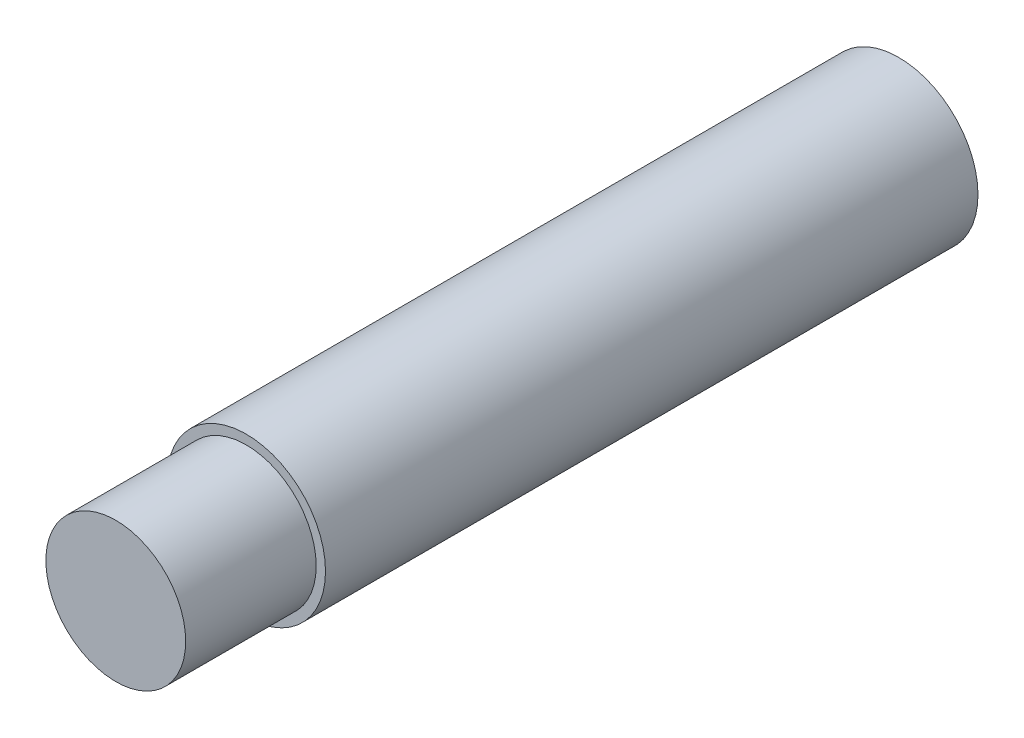
ISO-10303-21;
HEADER;
FILE_DESCRIPTION(('STEP AP214'),'2;1');
FILE_NAME('part.step','',(''),(''),'','','');
FILE_SCHEMA(('AUTOMOTIVE_DESIGN { 1 0 10303 214 1 1 1 1 }'));
ENDSEC;
DATA;
#1=APPLICATION_CONTEXT('core data for automotive mechanical design processes');
#2=APPLICATION_PROTOCOL_DEFINITION('international standard','automotive_design',2000,#1);
#3=PRODUCT_CONTEXT('',#1,'mechanical');
#4=PRODUCT('Part','Part','',(#3));
#5=PRODUCT_RELATED_PRODUCT_CATEGORY('part','',(#4));
#6=PRODUCT_DEFINITION_FORMATION('','',#4);
#7=PRODUCT_DEFINITION_CONTEXT('part definition',#1,'design');
#8=PRODUCT_DEFINITION('design','',#6,#7);
#9=PRODUCT_DEFINITION_SHAPE('','',#8);
#10=(LENGTH_UNIT() NAMED_UNIT(*) SI_UNIT(.MILLI.,.METRE.));
#11=(NAMED_UNIT(*) PLANE_ANGLE_UNIT() SI_UNIT($,.RADIAN.));
#12=(NAMED_UNIT(*) SI_UNIT($,.STERADIAN.) SOLID_ANGLE_UNIT());
#13=UNCERTAINTY_MEASURE_WITH_UNIT(LENGTH_MEASURE(1.E-05),#10,'distance_accuracy_value','');
#14=(GEOMETRIC_REPRESENTATION_CONTEXT(3) GLOBAL_UNCERTAINTY_ASSIGNED_CONTEXT((#13)) GLOBAL_UNIT_ASSIGNED_CONTEXT((#10,
#11,#12)) REPRESENTATION_CONTEXT('',''));
#15=CARTESIAN_POINT('',(0.,0.,0.));
#16=DIRECTION('',(0.,0.,1.));
#17=DIRECTION('',(1.,0.,0.));
#18=AXIS2_PLACEMENT_3D('',#15,#16,#17);
#19=CARTESIAN_POINT('',(0.,0.,35.));
#20=DIRECTION('',(0.,0.,-1.));
#21=DIRECTION('',(-1.,0.,0.));
#22=AXIS2_PLACEMENT_3D('',#19,#20,#21);
#23=CYLINDRICAL_SURFACE('',#22,4.25);
#24=CARTESIAN_POINT('',(0.,0.,35.));
#25=DIRECTION('',(0.,0.,1.));
#26=DIRECTION('',(1.,0.,0.));
#27=AXIS2_PLACEMENT_3D('',#24,#25,#26);
#28=CIRCLE('',#27,4.25);
#29=CARTESIAN_POINT('',(4.25,0.,35.));
#30=VERTEX_POINT('',#29);
#31=EDGE_CURVE('E48',#30,#30,#28,.T.);
#32=ORIENTED_EDGE('',*,*,#31,.F.);
#33=EDGE_LOOP('',(#32));
#34=FACE_BOUND('',#33,.T.);
#35=CARTESIAN_POINT('',(0.,0.,0.));
#36=DIRECTION('',(0.,0.,1.));
#37=DIRECTION('',(1.,0.,0.));
#38=AXIS2_PLACEMENT_3D('',#35,#36,#37);
#39=CIRCLE('',#38,4.25);
#40=CARTESIAN_POINT('',(4.25,0.,0.));
#41=VERTEX_POINT('',#40);
#42=EDGE_CURVE('E53',#41,#41,#39,.T.);
#43=ORIENTED_EDGE('',*,*,#42,.T.);
#44=EDGE_LOOP('',(#43));
#45=FACE_BOUND('',#44,.T.);
#46=ADVANCED_FACE('F41',(#34,#45),#23,.T.);
#47=CARTESIAN_POINT('',(0.,0.,35.));
#48=DIRECTION('',(0.,0.,1.));
#49=DIRECTION('',(1.,0.,0.));
#50=AXIS2_PLACEMENT_3D('',#47,#48,#49);
#51=PLANE('',#50);
#52=CARTESIAN_POINT('',(0.,0.,35.));
#53=DIRECTION('',(0.,0.,1.));
#54=DIRECTION('',(1.,0.,0.));
#55=AXIS2_PLACEMENT_3D('',#52,#53,#54);
#56=CIRCLE('',#55,3.75);
#57=CARTESIAN_POINT('',(3.75,0.,35.));
#58=VERTEX_POINT('',#57);
#59=EDGE_CURVE('E10',#58,#58,#56,.T.);
#60=ORIENTED_EDGE('',*,*,#59,.F.);
#61=EDGE_LOOP('',(#60));
#62=FACE_BOUND('',#61,.T.);
#63=ORIENTED_EDGE('',*,*,#31,.T.);
#64=EDGE_LOOP('',(#63));
#65=FACE_BOUND('',#64,.T.);
#66=ADVANCED_FACE('F76',(#62,#65),#51,.T.);
#67=CARTESIAN_POINT('',(0.,0.,0.));
#68=DIRECTION('',(0.,0.,1.));
#69=DIRECTION('',(1.,0.,0.));
#70=AXIS2_PLACEMENT_3D('',#67,#68,#69);
#71=PLANE('',#70);
#72=ORIENTED_EDGE('',*,*,#42,.F.);
#73=EDGE_LOOP('',(#72));
#74=FACE_BOUND('',#73,.T.);
#75=ADVANCED_FACE('F69',(#74),#71,.F.);
#76=CARTESIAN_POINT('',(0.,0.,5.50000000000001));
#77=DIRECTION('',(0.,0.,1.));
#78=DIRECTION('',(1.,0.,0.));
#79=AXIS2_PLACEMENT_3D('',#76,#77,#78);
#80=CYLINDRICAL_SURFACE('',#79,3.75);
#81=ORIENTED_EDGE('',*,*,#59,.T.);
#82=EDGE_LOOP('',(#81));
#83=FACE_BOUND('',#82,.T.);
#84=CARTESIAN_POINT('',(0.,0.,42.));
#85=DIRECTION('',(0.,0.,1.));
#86=DIRECTION('',(1.,0.,0.));
#87=AXIS2_PLACEMENT_3D('',#84,#85,#86);
#88=CIRCLE('',#87,3.75);
#89=CARTESIAN_POINT('',(3.75,0.,42.));
#90=VERTEX_POINT('',#89);
#91=EDGE_CURVE('E59',#90,#90,#88,.T.);
#92=ORIENTED_EDGE('',*,*,#91,.F.);
#93=EDGE_LOOP('',(#92));
#94=FACE_BOUND('',#93,.T.);
#95=ADVANCED_FACE('F67',(#83,#94),#80,.T.);
#96=CARTESIAN_POINT('',(0.,0.,42.));
#97=DIRECTION('',(0.,0.,1.));
#98=DIRECTION('',(1.,0.,0.));
#99=AXIS2_PLACEMENT_3D('',#96,#97,#98);
#100=PLANE('',#99);
#101=ORIENTED_EDGE('',*,*,#91,.T.);
#102=EDGE_LOOP('',(#101));
#103=FACE_BOUND('',#102,.T.);
#104=ADVANCED_FACE('F65',(#103),#100,.T.);
#105=CLOSED_SHELL('',(#46,#66,#75,#95,#104));
#106=MANIFOLD_SOLID_BREP('B2',#105);
#107=ADVANCED_BREP_SHAPE_REPRESENTATION('',(#18,#106),#14);
#108=SHAPE_DEFINITION_REPRESENTATION(#9,#107);
ENDSEC;
END-ISO-10303-21;
